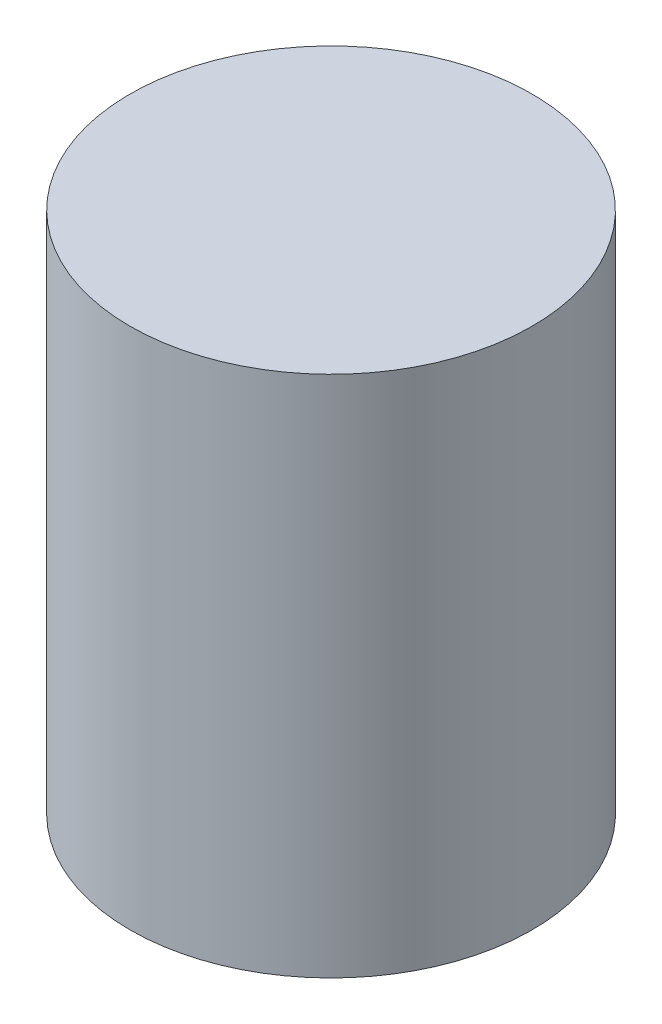
ISO-10303-21;
HEADER;
FILE_DESCRIPTION(('STEP AP214'),'2;1');
FILE_NAME('part.step','',(''),(''),'','','');
FILE_SCHEMA(('AUTOMOTIVE_DESIGN { 1 0 10303 214 1 1 1 1 }'));
ENDSEC;
DATA;
#1=APPLICATION_CONTEXT('core data for automotive mechanical design processes');
#2=APPLICATION_PROTOCOL_DEFINITION('international standard','automotive_design',2000,#1);
#3=PRODUCT_CONTEXT('',#1,'mechanical');
#4=PRODUCT('Part','Part','',(#3));
#5=PRODUCT_RELATED_PRODUCT_CATEGORY('part','',(#4));
#6=PRODUCT_DEFINITION_FORMATION('','',#4);
#7=PRODUCT_DEFINITION_CONTEXT('part definition',#1,'design');
#8=PRODUCT_DEFINITION('design','',#6,#7);
#9=PRODUCT_DEFINITION_SHAPE('','',#8);
#10=(LENGTH_UNIT() NAMED_UNIT(*) SI_UNIT(.MILLI.,.METRE.));
#11=(NAMED_UNIT(*) PLANE_ANGLE_UNIT() SI_UNIT($,.RADIAN.));
#12=(NAMED_UNIT(*) SI_UNIT($,.STERADIAN.) SOLID_ANGLE_UNIT());
#13=UNCERTAINTY_MEASURE_WITH_UNIT(LENGTH_MEASURE(1.E-05),#10,'distance_accuracy_value','');
#14=(GEOMETRIC_REPRESENTATION_CONTEXT(3) GLOBAL_UNCERTAINTY_ASSIGNED_CONTEXT((#13)) GLOBAL_UNIT_ASSIGNED_CONTEXT((#10,
#11,#12)) REPRESENTATION_CONTEXT('',''));
#15=CARTESIAN_POINT('',(0.,0.,0.));
#16=DIRECTION('',(0.,0.,1.));
#17=DIRECTION('',(1.,0.,0.));
#18=AXIS2_PLACEMENT_3D('',#15,#16,#17);
#19=CARTESIAN_POINT('',(-13.6798457858841,-4.09801948210229,47.7982201124123));
#20=DIRECTION('',(0.,1.,0.));
#21=DIRECTION('',(0.,0.,1.));
#22=AXIS2_PLACEMENT_3D('',#19,#20,#21);
#23=CYLINDRICAL_SURFACE('',#22,15.);
#24=CARTESIAN_POINT('',(-13.6798457858841,-4.09801948210229,47.7982201124123));
#25=DIRECTION('',(0.,1.,0.));
#26=DIRECTION('',(0.,0.,1.));
#27=AXIS2_PLACEMENT_3D('',#24,#25,#26);
#28=CIRCLE('',#27,15.);
#29=CARTESIAN_POINT('',(-13.6798457858841,-4.09801948210229,62.7982201124123));
#30=VERTEX_POINT('',#29);
#31=EDGE_CURVE('E10',#30,#30,#28,.T.);
#32=ORIENTED_EDGE('',*,*,#31,.T.);
#33=EDGE_LOOP('',(#32));
#34=FACE_BOUND('',#33,.T.);
#35=CARTESIAN_POINT('',(-13.6798457858841,34.9019805178977,47.7982201124123));
#36=DIRECTION('',(0.,1.,0.));
#37=DIRECTION('',(0.,0.,1.));
#38=AXIS2_PLACEMENT_3D('',#35,#36,#37);
#39=CIRCLE('',#38,15.);
#40=CARTESIAN_POINT('',(-13.6798457858841,34.9019805178977,62.7982201124123));
#41=VERTEX_POINT('',#40);
#42=EDGE_CURVE('E42',#41,#41,#39,.T.);
#43=ORIENTED_EDGE('',*,*,#42,.F.);
#44=EDGE_LOOP('',(#43));
#45=FACE_BOUND('',#44,.T.);
#46=ADVANCED_FACE('F39',(#34,#45),#23,.T.);
#47=CARTESIAN_POINT('',(-13.6798457858841,-4.09801948210229,47.7982201124123));
#48=DIRECTION('',(0.,1.,0.));
#49=DIRECTION('',(0.,0.,1.));
#50=AXIS2_PLACEMENT_3D('',#47,#48,#49);
#51=PLANE('',#50);
#52=ORIENTED_EDGE('',*,*,#31,.F.);
#53=EDGE_LOOP('',(#52));
#54=FACE_BOUND('',#53,.T.);
#55=ADVANCED_FACE('F54',(#54),#51,.F.);
#56=CARTESIAN_POINT('',(-13.6798457858841,34.9019805178977,47.7982201124123));
#57=DIRECTION('',(0.,1.,0.));
#58=DIRECTION('',(0.,0.,1.));
#59=AXIS2_PLACEMENT_3D('',#56,#57,#58);
#60=PLANE('',#59);
#61=ORIENTED_EDGE('',*,*,#42,.T.);
#62=EDGE_LOOP('',(#61));
#63=FACE_BOUND('',#62,.T.);
#64=ADVANCED_FACE('F51',(#63),#60,.T.);
#65=CLOSED_SHELL('',(#46,#55,#64));
#66=MANIFOLD_SOLID_BREP('B2',#65);
#67=ADVANCED_BREP_SHAPE_REPRESENTATION('',(#18,#66),#14);
#68=SHAPE_DEFINITION_REPRESENTATION(#9,#67);
ENDSEC;
END-ISO-10303-21;
